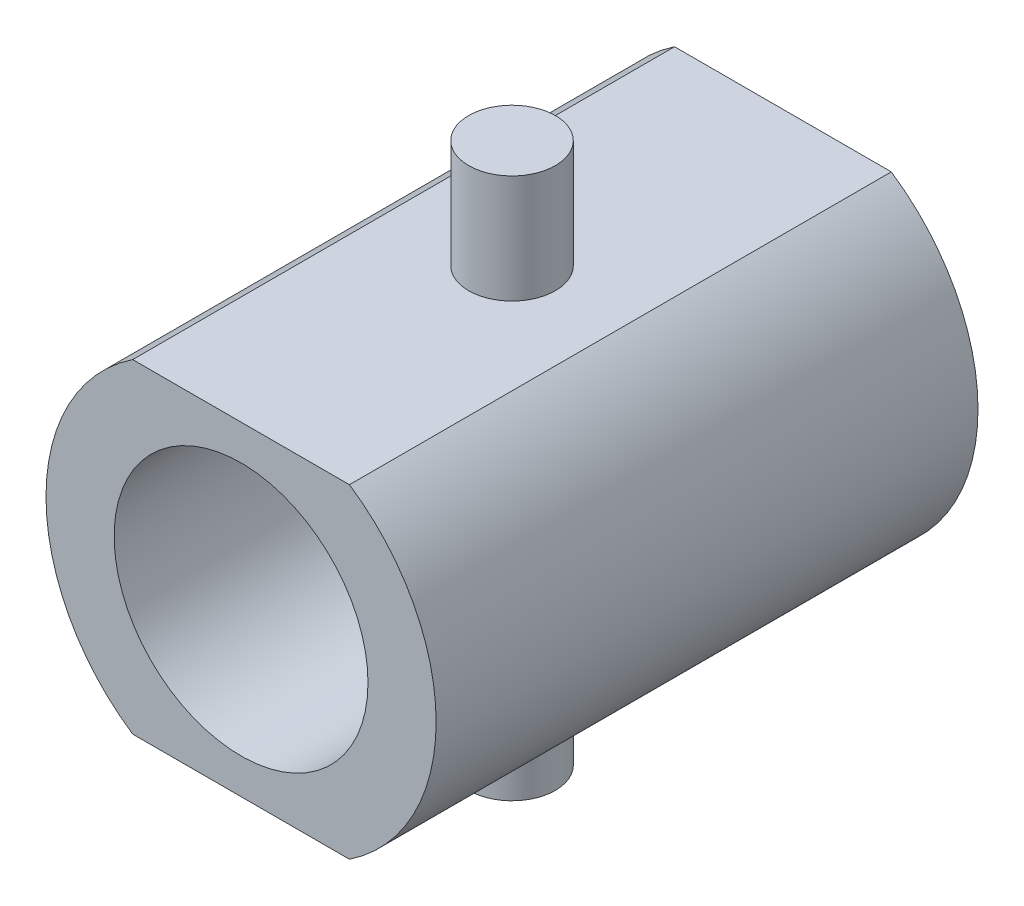
ISO-10303-21;
HEADER;
FILE_DESCRIPTION(('STEP AP214'),'2;1');
FILE_NAME('part.step','',(''),(''),'','','');
FILE_SCHEMA(('AUTOMOTIVE_DESIGN { 1 0 10303 214 1 1 1 1 }'));
ENDSEC;
DATA;
#1=APPLICATION_CONTEXT('core data for automotive mechanical design processes');
#2=APPLICATION_PROTOCOL_DEFINITION('international standard','automotive_design',2000,#1);
#3=PRODUCT_CONTEXT('',#1,'mechanical');
#4=PRODUCT('Part','Part','',(#3));
#5=PRODUCT_RELATED_PRODUCT_CATEGORY('part','',(#4));
#6=PRODUCT_DEFINITION_FORMATION('','',#4);
#7=PRODUCT_DEFINITION_CONTEXT('part definition',#1,'design');
#8=PRODUCT_DEFINITION('design','',#6,#7);
#9=PRODUCT_DEFINITION_SHAPE('','',#8);
#10=(LENGTH_UNIT() NAMED_UNIT(*) SI_UNIT(.MILLI.,.METRE.));
#11=(NAMED_UNIT(*) PLANE_ANGLE_UNIT() SI_UNIT($,.RADIAN.));
#12=(NAMED_UNIT(*) SI_UNIT($,.STERADIAN.) SOLID_ANGLE_UNIT());
#13=UNCERTAINTY_MEASURE_WITH_UNIT(LENGTH_MEASURE(1.E-05),#10,'distance_accuracy_value','');
#14=(GEOMETRIC_REPRESENTATION_CONTEXT(3) GLOBAL_UNCERTAINTY_ASSIGNED_CONTEXT((#13)) GLOBAL_UNIT_ASSIGNED_CONTEXT((#10,
#11,#12)) REPRESENTATION_CONTEXT('',''));
#15=CARTESIAN_POINT('',(0.,0.,0.));
#16=DIRECTION('',(0.,0.,1.));
#17=DIRECTION('',(1.,0.,0.));
#18=AXIS2_PLACEMENT_3D('',#15,#16,#17);
#19=CARTESIAN_POINT('',(0.,37.4165738677394,125.));
#20=DIRECTION('',(0.,1.,0.));
#21=DIRECTION('',(0.,0.,1.));
#22=AXIS2_PLACEMENT_3D('',#19,#20,#21);
#23=PLANE('',#22);
#24=CARTESIAN_POINT('',(0.,37.4165738677394,62.5));
#25=DIRECTION('',(0.,1.,0.));
#26=DIRECTION('',(0.,0.,1.));
#27=AXIS2_PLACEMENT_3D('',#24,#25,#26);
#28=CIRCLE('',#27,10.);
#29=CARTESIAN_POINT('',(0.,37.4165738677394,72.5));
#30=VERTEX_POINT('',#29);
#31=EDGE_CURVE('E111',#30,#30,#28,.T.);
#32=ORIENTED_EDGE('',*,*,#31,.F.);
#33=EDGE_LOOP('',(#32));
#34=FACE_BOUND('',#33,.T.);
#35=DIRECTION('',(1.,0.,0.));
#36=VECTOR('',#35,1.);
#37=CARTESIAN_POINT('',(0.,37.4165738677394,0.));
#38=LINE('',#37,#36);
#39=CARTESIAN_POINT('',(-25.,37.4165738677394,0.));
#40=VERTEX_POINT('',#39);
#41=CARTESIAN_POINT('',(25.,37.4165738677394,0.));
#42=VERTEX_POINT('',#41);
#43=EDGE_CURVE('E101',#40,#42,#38,.T.);
#44=ORIENTED_EDGE('',*,*,#43,.F.);
#45=DIRECTION('',(0.,0.,-1.));
#46=VECTOR('',#45,1.);
#47=CARTESIAN_POINT('',(-25.,37.4165738677394,125.));
#48=LINE('',#47,#46);
#49=CARTESIAN_POINT('',(-25.,37.4165738677394,125.));
#50=VERTEX_POINT('',#49);
#51=EDGE_CURVE('E11',#50,#40,#48,.T.);
#52=ORIENTED_EDGE('',*,*,#51,.F.);
#53=DIRECTION('',(1.,0.,0.));
#54=VECTOR('',#53,1.);
#55=CARTESIAN_POINT('',(0.,37.4165738677394,125.));
#56=LINE('',#55,#54);
#57=CARTESIAN_POINT('',(25.,37.4165738677394,125.));
#58=VERTEX_POINT('',#57);
#59=EDGE_CURVE('E89',#50,#58,#56,.T.);
#60=ORIENTED_EDGE('',*,*,#59,.T.);
#61=DIRECTION('',(0.,0.,-1.));
#62=VECTOR('',#61,1.);
#63=CARTESIAN_POINT('',(25.,37.4165738677394,125.));
#64=LINE('',#63,#62);
#65=EDGE_CURVE('E71',#58,#42,#64,.T.);
#66=ORIENTED_EDGE('',*,*,#65,.T.);
#67=EDGE_LOOP('',(#44,#52,#60,#66));
#68=FACE_BOUND('',#67,.T.);
#69=ADVANCED_FACE('F32',(#34,#68),#23,.T.);
#70=CARTESIAN_POINT('',(0.,0.,125.));
#71=DIRECTION('',(0.,0.,-1.));
#72=DIRECTION('',(-1.,0.,0.));
#73=AXIS2_PLACEMENT_3D('',#70,#71,#72);
#74=CYLINDRICAL_SURFACE('',#73,45.);
#75=CARTESIAN_POINT('',(0.,0.,0.));
#76=DIRECTION('',(0.,0.,1.));
#77=DIRECTION('',(1.,0.,0.));
#78=AXIS2_PLACEMENT_3D('',#75,#76,#77);
#79=CIRCLE('',#78,45.);
#80=CARTESIAN_POINT('',(-25.,-37.4165738677394,0.));
#81=VERTEX_POINT('',#80);
#82=EDGE_CURVE('E94',#40,#81,#79,.T.);
#83=ORIENTED_EDGE('',*,*,#82,.T.);
#84=DIRECTION('',(0.,0.,-1.));
#85=VECTOR('',#84,1.);
#86=CARTESIAN_POINT('',(-25.,-37.4165738677394,125.));
#87=LINE('',#86,#85);
#88=CARTESIAN_POINT('',(-25.,-37.4165738677394,125.));
#89=VERTEX_POINT('',#88);
#90=EDGE_CURVE('E41',#89,#81,#87,.T.);
#91=ORIENTED_EDGE('',*,*,#90,.F.);
#92=CARTESIAN_POINT('',(0.,0.,125.));
#93=DIRECTION('',(0.,0.,1.));
#94=DIRECTION('',(1.,0.,0.));
#95=AXIS2_PLACEMENT_3D('',#92,#93,#94);
#96=CIRCLE('',#95,45.);
#97=EDGE_CURVE('E86',#50,#89,#96,.T.);
#98=ORIENTED_EDGE('',*,*,#97,.F.);
#99=ORIENTED_EDGE('',*,*,#51,.T.);
#100=EDGE_LOOP('',(#83,#91,#98,#99));
#101=FACE_BOUND('',#100,.T.);
#102=ADVANCED_FACE('F92',(#101),#74,.T.);
#103=CARTESIAN_POINT('',(0.,-37.4165738677394,125.));
#104=DIRECTION('',(0.,1.,0.));
#105=DIRECTION('',(0.,0.,1.));
#106=AXIS2_PLACEMENT_3D('',#103,#104,#105);
#107=PLANE('',#106);
#108=CARTESIAN_POINT('',(0.,-37.4165738677394,62.5));
#109=DIRECTION('',(0.,1.,0.));
#110=DIRECTION('',(0.,0.,1.));
#111=AXIS2_PLACEMENT_3D('',#108,#109,#110);
#112=CIRCLE('',#111,10.);
#113=CARTESIAN_POINT('',(0.,-37.4165738677394,72.5));
#114=VERTEX_POINT('',#113);
#115=EDGE_CURVE('E117',#114,#114,#112,.T.);
#116=ORIENTED_EDGE('',*,*,#115,.T.);
#117=EDGE_LOOP('',(#116));
#118=FACE_BOUND('',#117,.T.);
#119=DIRECTION('',(1.,0.,0.));
#120=VECTOR('',#119,1.);
#121=CARTESIAN_POINT('',(0.,-37.4165738677394,0.));
#122=LINE('',#121,#120);
#123=CARTESIAN_POINT('',(25.,-37.4165738677394,0.));
#124=VERTEX_POINT('',#123);
#125=EDGE_CURVE('E98',#81,#124,#122,.T.);
#126=ORIENTED_EDGE('',*,*,#125,.T.);
#127=DIRECTION('',(0.,0.,-1.));
#128=VECTOR('',#127,1.);
#129=CARTESIAN_POINT('',(25.,-37.4165738677394,125.));
#130=LINE('',#129,#128);
#131=CARTESIAN_POINT('',(25.,-37.4165738677394,125.));
#132=VERTEX_POINT('',#131);
#133=EDGE_CURVE('E85',#132,#124,#130,.T.);
#134=ORIENTED_EDGE('',*,*,#133,.F.);
#135=DIRECTION('',(1.,0.,0.));
#136=VECTOR('',#135,1.);
#137=CARTESIAN_POINT('',(0.,-37.4165738677394,125.));
#138=LINE('',#137,#136);
#139=EDGE_CURVE('E79',#89,#132,#138,.T.);
#140=ORIENTED_EDGE('',*,*,#139,.F.);
#141=ORIENTED_EDGE('',*,*,#90,.T.);
#142=EDGE_LOOP('',(#126,#134,#140,#141));
#143=FACE_BOUND('',#142,.T.);
#144=ADVANCED_FACE('F82',(#118,#143),#107,.F.);
#145=CARTESIAN_POINT('',(0.,0.,125.));
#146=DIRECTION('',(0.,0.,-1.));
#147=DIRECTION('',(-1.,0.,0.));
#148=AXIS2_PLACEMENT_3D('',#145,#146,#147);
#149=CYLINDRICAL_SURFACE('',#148,29.2810185423499);
#150=CARTESIAN_POINT('',(0.,0.,125.));
#151=DIRECTION('',(0.,0.,1.));
#152=DIRECTION('',(1.,0.,0.));
#153=AXIS2_PLACEMENT_3D('',#150,#151,#152);
#154=CIRCLE('',#153,29.2810185423499);
#155=CARTESIAN_POINT('',(29.2810185423499,0.,125.));
#156=VERTEX_POINT('',#155);
#157=EDGE_CURVE('E108',#156,#156,#154,.T.);
#158=ORIENTED_EDGE('',*,*,#157,.T.);
#159=EDGE_LOOP('',(#158));
#160=FACE_BOUND('',#159,.T.);
#161=CARTESIAN_POINT('',(0.,0.,0.));
#162=DIRECTION('',(0.,0.,1.));
#163=DIRECTION('',(1.,0.,0.));
#164=AXIS2_PLACEMENT_3D('',#161,#162,#163);
#165=CIRCLE('',#164,29.2810185423499);
#166=CARTESIAN_POINT('',(29.2810185423499,0.,0.));
#167=VERTEX_POINT('',#166);
#168=EDGE_CURVE('E103',#167,#167,#165,.T.);
#169=ORIENTED_EDGE('',*,*,#168,.F.);
#170=EDGE_LOOP('',(#169));
#171=FACE_BOUND('',#170,.T.);
#172=ADVANCED_FACE('F34',(#160,#171),#149,.F.);
#173=EDGE_CURVE('E64',#124,#42,#79,.T.);
#174=ORIENTED_EDGE('',*,*,#173,.T.);
#175=ORIENTED_EDGE('',*,*,#65,.F.);
#176=EDGE_CURVE('E49',#132,#58,#96,.T.);
#177=ORIENTED_EDGE('',*,*,#176,.F.);
#178=ORIENTED_EDGE('',*,*,#133,.T.);
#179=EDGE_LOOP('',(#174,#175,#177,#178));
#180=FACE_BOUND('',#179,.T.);
#181=ADVANCED_FACE('F140',(#180),#74,.T.);
#182=CARTESIAN_POINT('',(0.,0.,125.));
#183=DIRECTION('',(0.,0.,1.));
#184=DIRECTION('',(1.,0.,0.));
#185=AXIS2_PLACEMENT_3D('',#182,#183,#184);
#186=PLANE('',#185);
#187=ORIENTED_EDGE('',*,*,#157,.F.);
#188=EDGE_LOOP('',(#187));
#189=FACE_BOUND('',#188,.T.);
#190=ORIENTED_EDGE('',*,*,#59,.F.);
#191=ORIENTED_EDGE('',*,*,#97,.T.);
#192=ORIENTED_EDGE('',*,*,#139,.T.);
#193=ORIENTED_EDGE('',*,*,#176,.T.);
#194=EDGE_LOOP('',(#190,#191,#192,#193));
#195=FACE_BOUND('',#194,.T.);
#196=ADVANCED_FACE('F88',(#189,#195),#186,.T.);
#197=CARTESIAN_POINT('',(0.,0.,0.));
#198=DIRECTION('',(0.,0.,1.));
#199=DIRECTION('',(1.,0.,0.));
#200=AXIS2_PLACEMENT_3D('',#197,#198,#199);
#201=PLANE('',#200);
#202=ORIENTED_EDGE('',*,*,#168,.T.);
#203=EDGE_LOOP('',(#202));
#204=FACE_BOUND('',#203,.T.);
#205=ORIENTED_EDGE('',*,*,#43,.T.);
#206=ORIENTED_EDGE('',*,*,#173,.F.);
#207=ORIENTED_EDGE('',*,*,#125,.F.);
#208=ORIENTED_EDGE('',*,*,#82,.F.);
#209=EDGE_LOOP('',(#205,#206,#207,#208));
#210=FACE_BOUND('',#209,.T.);
#211=ADVANCED_FACE('F148',(#204,#210),#201,.F.);
#212=CARTESIAN_POINT('',(0.,62.4165738677394,62.5));
#213=DIRECTION('',(0.,-1.,0.));
#214=DIRECTION('',(0.,0.,-1.));
#215=AXIS2_PLACEMENT_3D('',#212,#213,#214);
#216=CYLINDRICAL_SURFACE('',#215,10.);
#217=CARTESIAN_POINT('',(0.,62.4165738677394,62.5));
#218=DIRECTION('',(0.,1.,0.));
#219=DIRECTION('',(0.,0.,1.));
#220=AXIS2_PLACEMENT_3D('',#217,#218,#219);
#221=CIRCLE('',#220,10.);
#222=CARTESIAN_POINT('',(0.,62.4165738677394,72.5));
#223=VERTEX_POINT('',#222);
#224=EDGE_CURVE('E105',#223,#223,#221,.T.);
#225=ORIENTED_EDGE('',*,*,#224,.F.);
#226=EDGE_LOOP('',(#225));
#227=FACE_BOUND('',#226,.T.);
#228=ORIENTED_EDGE('',*,*,#31,.T.);
#229=EDGE_LOOP('',(#228));
#230=FACE_BOUND('',#229,.T.);
#231=ADVANCED_FACE('F151',(#227,#230),#216,.T.);
#232=CARTESIAN_POINT('',(0.,62.4165738677394,62.5));
#233=DIRECTION('',(0.,1.,0.));
#234=DIRECTION('',(0.,0.,1.));
#235=AXIS2_PLACEMENT_3D('',#232,#233,#234);
#236=PLANE('',#235);
#237=ORIENTED_EDGE('',*,*,#224,.T.);
#238=EDGE_LOOP('',(#237));
#239=FACE_BOUND('',#238,.T.);
#240=ADVANCED_FACE('F132',(#239),#236,.T.);
#241=CARTESIAN_POINT('',(0.,-62.4165738677394,62.5));
#242=DIRECTION('',(0.,1.,0.));
#243=DIRECTION('',(0.,0.,1.));
#244=AXIS2_PLACEMENT_3D('',#241,#242,#243);
#245=CYLINDRICAL_SURFACE('',#244,10.);
#246=CARTESIAN_POINT('',(0.,-62.4165738677394,62.5));
#247=DIRECTION('',(0.,1.,0.));
#248=DIRECTION('',(0.,0.,1.));
#249=AXIS2_PLACEMENT_3D('',#246,#247,#248);
#250=CIRCLE('',#249,10.);
#251=CARTESIAN_POINT('',(0.,-62.4165738677394,72.5));
#252=VERTEX_POINT('',#251);
#253=EDGE_CURVE('E114',#252,#252,#250,.T.);
#254=ORIENTED_EDGE('',*,*,#253,.T.);
#255=EDGE_LOOP('',(#254));
#256=FACE_BOUND('',#255,.T.);
#257=ORIENTED_EDGE('',*,*,#115,.F.);
#258=EDGE_LOOP('',(#257));
#259=FACE_BOUND('',#258,.T.);
#260=ADVANCED_FACE('F123',(#256,#259),#245,.T.);
#261=CARTESIAN_POINT('',(0.,-62.4165738677394,62.5));
#262=DIRECTION('',(0.,-1.,0.));
#263=DIRECTION('',(0.,0.,1.));
#264=AXIS2_PLACEMENT_3D('',#261,#262,#263);
#265=PLANE('',#264);
#266=ORIENTED_EDGE('',*,*,#253,.F.);
#267=EDGE_LOOP('',(#266));
#268=FACE_BOUND('',#267,.T.);
#269=ADVANCED_FACE('F126',(#268),#265,.T.);
#270=CLOSED_SHELL('',(#69,#102,#144,#172,#181,#196,#211,#231,#240,#260,#269));
#271=MANIFOLD_SOLID_BREP('B2',#270);
#272=ADVANCED_BREP_SHAPE_REPRESENTATION('',(#18,#271),#14);
#273=SHAPE_DEFINITION_REPRESENTATION(#9,#272);
ENDSEC;
END-ISO-10303-21;
